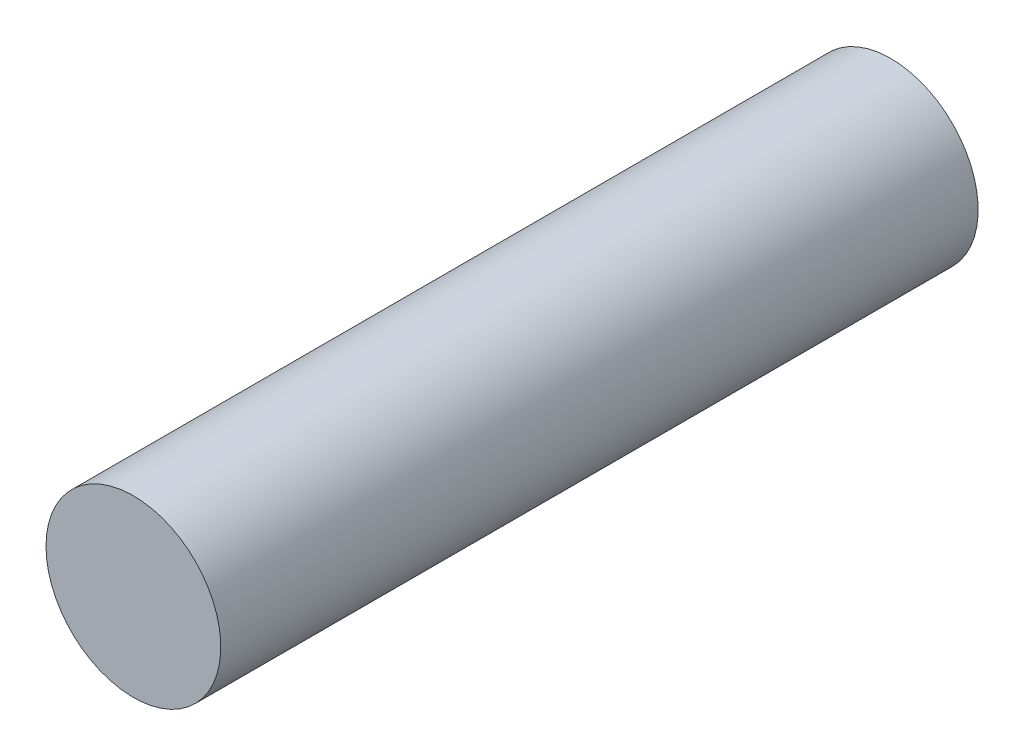
ISO-10303-21;
HEADER;
FILE_DESCRIPTION(('STEP AP214'),'2;1');
FILE_NAME('part.step','',(''),(''),'','','');
FILE_SCHEMA(('AUTOMOTIVE_DESIGN { 1 0 10303 214 1 1 1 1 }'));
ENDSEC;
DATA;
#1=APPLICATION_CONTEXT('core data for automotive mechanical design processes');
#2=APPLICATION_PROTOCOL_DEFINITION('international standard','automotive_design',2000,#1);
#3=PRODUCT_CONTEXT('',#1,'mechanical');
#4=PRODUCT('Part','Part','',(#3));
#5=PRODUCT_RELATED_PRODUCT_CATEGORY('part','',(#4));
#6=PRODUCT_DEFINITION_FORMATION('','',#4);
#7=PRODUCT_DEFINITION_CONTEXT('part definition',#1,'design');
#8=PRODUCT_DEFINITION('design','',#6,#7);
#9=PRODUCT_DEFINITION_SHAPE('','',#8);
#10=(LENGTH_UNIT() NAMED_UNIT(*) SI_UNIT(.MILLI.,.METRE.));
#11=(NAMED_UNIT(*) PLANE_ANGLE_UNIT() SI_UNIT($,.RADIAN.));
#12=(NAMED_UNIT(*) SI_UNIT($,.STERADIAN.) SOLID_ANGLE_UNIT());
#13=UNCERTAINTY_MEASURE_WITH_UNIT(LENGTH_MEASURE(1.E-05),#10,'distance_accuracy_value','');
#14=(GEOMETRIC_REPRESENTATION_CONTEXT(3) GLOBAL_UNCERTAINTY_ASSIGNED_CONTEXT((#13)) GLOBAL_UNIT_ASSIGNED_CONTEXT((#10,
#11,#12)) REPRESENTATION_CONTEXT('',''));
#15=CARTESIAN_POINT('',(0.,0.,0.));
#16=DIRECTION('',(0.,0.,1.));
#17=DIRECTION('',(1.,0.,0.));
#18=AXIS2_PLACEMENT_3D('',#15,#16,#17);
#19=CARTESIAN_POINT('',(0.,0.,35.75));
#20=DIRECTION('',(0.,0.,-1.));
#21=DIRECTION('',(-1.,0.,0.));
#22=AXIS2_PLACEMENT_3D('',#19,#20,#21);
#23=CYLINDRICAL_SURFACE('',#22,2.25);
#24=CARTESIAN_POINT('',(0.,0.,35.75));
#25=DIRECTION('',(0.,0.,1.));
#26=DIRECTION('',(1.,0.,0.));
#27=AXIS2_PLACEMENT_3D('',#24,#25,#26);
#28=CIRCLE('',#27,2.25);
#29=CARTESIAN_POINT('',(-2.25,0.,35.75));
#30=VERTEX_POINT('',#29);
#31=EDGE_CURVE('E10',#30,#30,#28,.T.);
#32=CARTESIAN_POINT('',(0.,0.,16.25));
#33=DIRECTION('',(0.,0.,1.));
#34=DIRECTION('',(1.,0.,0.));
#35=AXIS2_PLACEMENT_3D('',#32,#33,#34);
#36=CIRCLE('',#35,2.25);
#37=CARTESIAN_POINT('',(-2.25,0.,16.25));
#38=VERTEX_POINT('',#37);
#39=EDGE_CURVE('E39',#38,#38,#36,.T.);
#40=CARTESIAN_POINT('',(-2.25,0.,35.75));
#41=CARTESIAN_POINT('',(-2.25,0.,35.546875));
#42=CARTESIAN_POINT('',(-2.25,0.,35.34375));
#43=CARTESIAN_POINT('',(-2.25,0.,34.9375));
#44=CARTESIAN_POINT('',(-2.25,0.,34.734375));
#45=CARTESIAN_POINT('',(-2.25,0.,34.328125));
#46=CARTESIAN_POINT('',(-2.25,0.,34.125));
#47=CARTESIAN_POINT('',(-2.25,0.,33.71875));
#48=CARTESIAN_POINT('',(-2.25,0.,33.515625));
#49=CARTESIAN_POINT('',(-2.25,0.,33.109375));
#50=CARTESIAN_POINT('',(-2.25,0.,32.90625));
#51=CARTESIAN_POINT('',(-2.25,0.,32.5));
#52=CARTESIAN_POINT('',(-2.25,0.,32.296875));
#53=CARTESIAN_POINT('',(-2.25,0.,31.890625));
#54=CARTESIAN_POINT('',(-2.25,0.,31.6875));
#55=CARTESIAN_POINT('',(-2.25,0.,31.28125));
#56=CARTESIAN_POINT('',(-2.25,0.,31.078125));
#57=CARTESIAN_POINT('',(-2.25,0.,30.671875));
#58=CARTESIAN_POINT('',(-2.25,0.,30.46875));
#59=CARTESIAN_POINT('',(-2.25,0.,30.0625));
#60=CARTESIAN_POINT('',(-2.25,0.,29.859375));
#61=CARTESIAN_POINT('',(-2.25,0.,29.453125));
#62=CARTESIAN_POINT('',(-2.25,0.,29.25));
#63=CARTESIAN_POINT('',(-2.25,0.,28.84375));
#64=CARTESIAN_POINT('',(-2.25,0.,28.640625));
#65=CARTESIAN_POINT('',(-2.25,0.,28.234375));
#66=CARTESIAN_POINT('',(-2.25,0.,28.03125));
#67=CARTESIAN_POINT('',(-2.25,0.,27.625));
#68=CARTESIAN_POINT('',(-2.25,0.,27.421875));
#69=CARTESIAN_POINT('',(-2.25,0.,27.015625));
#70=CARTESIAN_POINT('',(-2.25,0.,26.8125));
#71=CARTESIAN_POINT('',(-2.25,0.,26.40625));
#72=CARTESIAN_POINT('',(-2.25,0.,26.203125));
#73=CARTESIAN_POINT('',(-2.25,0.,25.796875));
#74=CARTESIAN_POINT('',(-2.25,0.,25.59375));
#75=CARTESIAN_POINT('',(-2.25,0.,25.1875));
#76=CARTESIAN_POINT('',(-2.25,0.,24.984375));
#77=CARTESIAN_POINT('',(-2.25,0.,24.578125));
#78=CARTESIAN_POINT('',(-2.25,0.,24.375));
#79=CARTESIAN_POINT('',(-2.25,0.,23.96875));
#80=CARTESIAN_POINT('',(-2.25,0.,23.765625));
#81=CARTESIAN_POINT('',(-2.25,0.,23.359375));
#82=CARTESIAN_POINT('',(-2.25,0.,23.15625));
#83=CARTESIAN_POINT('',(-2.25,0.,22.75));
#84=CARTESIAN_POINT('',(-2.25,0.,22.546875));
#85=CARTESIAN_POINT('',(-2.25,0.,22.140625));
#86=CARTESIAN_POINT('',(-2.25,0.,21.9375));
#87=CARTESIAN_POINT('',(-2.25,0.,21.53125));
#88=CARTESIAN_POINT('',(-2.25,0.,21.328125));
#89=CARTESIAN_POINT('',(-2.25,0.,20.921875));
#90=CARTESIAN_POINT('',(-2.25,0.,20.71875));
#91=CARTESIAN_POINT('',(-2.25,0.,20.3125));
#92=CARTESIAN_POINT('',(-2.25,0.,20.109375));
#93=CARTESIAN_POINT('',(-2.25,0.,19.703125));
#94=CARTESIAN_POINT('',(-2.25,0.,19.5));
#95=CARTESIAN_POINT('',(-2.25,0.,19.09375));
#96=CARTESIAN_POINT('',(-2.25,0.,18.890625));
#97=CARTESIAN_POINT('',(-2.25,0.,18.484375));
#98=CARTESIAN_POINT('',(-2.25,0.,18.28125));
#99=CARTESIAN_POINT('',(-2.25,0.,17.875));
#100=CARTESIAN_POINT('',(-2.25,0.,17.671875));
#101=CARTESIAN_POINT('',(-2.25,0.,17.265625));
#102=CARTESIAN_POINT('',(-2.25,0.,17.0625));
#103=CARTESIAN_POINT('',(-2.25,0.,16.65625));
#104=CARTESIAN_POINT('',(-2.25,0.,16.453125));
#105=CARTESIAN_POINT('',(-2.25,0.,16.25));
#106=B_SPLINE_CURVE_WITH_KNOTS('',3,(#40,#41,#42,#43,#44,#45,#46,#47,#48,#49,#50,#51,#52,#53,
#54,#55,#56,#57,#58,#59,#60,#61,#62,#63,#64,#65,#66,#67,#68,#69,#70,#71,#72,#73,#74,#75,#76,#77,
#78,#79,#80,#81,#82,#83,#84,#85,#86,#87,#88,#89,#90,#91,#92,#93,#94,#95,#96,#97,#98,#99,#100,
#101,#102,#103,#104,#105),.UNSPECIFIED.,.F.,.F.,(4,2,2,2,2,2,2,2,2,2,2,2,2,2,2,2,2,2,2,2,2,2,2,
2,2,2,2,2,2,2,2,2,4),(0.,0.609375000000002,1.21875,1.828125,2.4375,3.046875,3.65625,4.265625,
4.875,5.484375,6.09375,6.703125,7.3125,7.921875,8.53125,9.140625,9.75,10.359375,10.96875,
11.578125,12.1875,12.796875,13.40625,14.015625,14.625,15.234375,15.84375,16.453125,17.0625,
17.671875,18.28125,18.890625,19.5),.UNSPECIFIED.);
#107=EDGE_CURVE('BSEAM36',#30,#38,#106,.T.);
#108=ORIENTED_EDGE('',*,*,#31,.F.);
#109=ORIENTED_EDGE('',*,*,#39,.T.);
#110=ORIENTED_EDGE('',*,*,#107,.T.);
#111=ORIENTED_EDGE('',*,*,#107,.F.);
#112=EDGE_LOOP('',(#108,#110,#109,#111));
#113=FACE_BOUND('',#112,.T.);
#114=ADVANCED_FACE('F36',(#113),#23,.T.);
#115=CARTESIAN_POINT('',(0.,0.,35.75));
#116=DIRECTION('',(0.,0.,1.));
#117=DIRECTION('',(1.,0.,0.));
#118=AXIS2_PLACEMENT_3D('',#115,#116,#117);
#119=PLANE('',#118);
#120=ORIENTED_EDGE('',*,*,#31,.T.);
#121=EDGE_LOOP('',(#120));
#122=FACE_BOUND('',#121,.T.);
#123=ADVANCED_FACE('F51',(#122),#119,.T.);
#124=CARTESIAN_POINT('',(0.,0.,16.25));
#125=DIRECTION('',(0.,0.,1.));
#126=DIRECTION('',(1.,0.,0.));
#127=AXIS2_PLACEMENT_3D('',#124,#125,#126);
#128=PLANE('',#127);
#129=ORIENTED_EDGE('',*,*,#39,.F.);
#130=EDGE_LOOP('',(#129));
#131=FACE_BOUND('',#130,.T.);
#132=ADVANCED_FACE('F49',(#131),#128,.F.);
#133=CLOSED_SHELL('',(#114,#123,#132));
#134=MANIFOLD_SOLID_BREP('B2',#133);
#135=ADVANCED_BREP_SHAPE_REPRESENTATION('',(#18,#134),#14);
#136=SHAPE_DEFINITION_REPRESENTATION(#9,#135);
ENDSEC;
END-ISO-10303-21;
